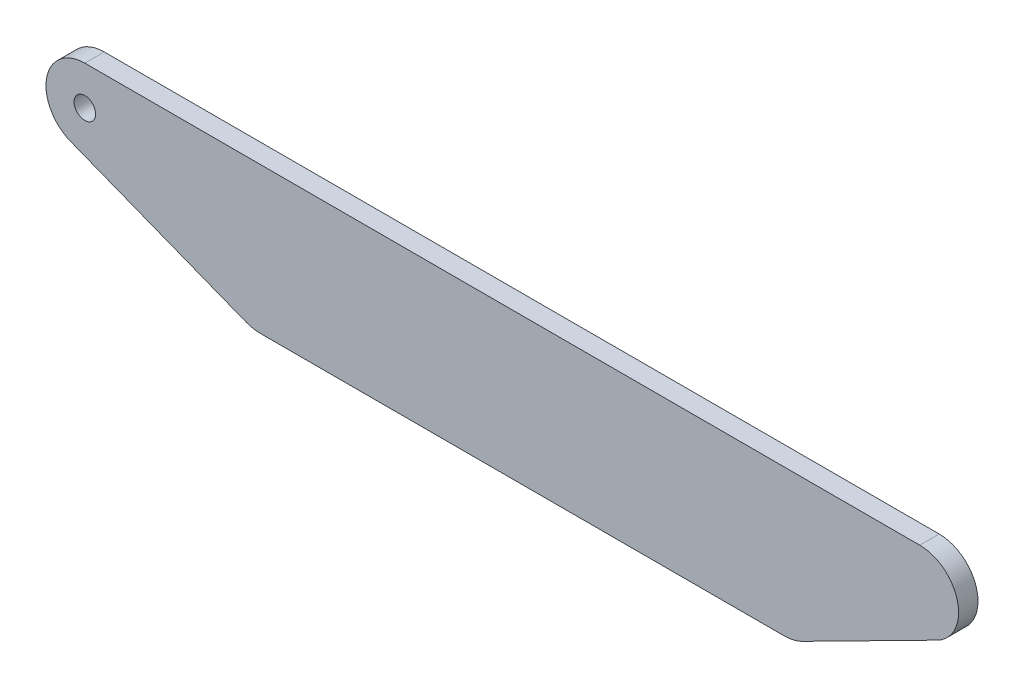
ISO-10303-21;
HEADER;
FILE_DESCRIPTION(('STEP AP214'),'2;1');
FILE_NAME('part.step','',(''),(''),'','','');
FILE_SCHEMA(('AUTOMOTIVE_DESIGN { 1 0 10303 214 1 1 1 1 }'));
ENDSEC;
DATA;
#1=APPLICATION_CONTEXT('core data for automotive mechanical design processes');
#2=APPLICATION_PROTOCOL_DEFINITION('international standard','automotive_design',2000,#1);
#3=PRODUCT_CONTEXT('',#1,'mechanical');
#4=PRODUCT('Part','Part','',(#3));
#5=PRODUCT_RELATED_PRODUCT_CATEGORY('part','',(#4));
#6=PRODUCT_DEFINITION_FORMATION('','',#4);
#7=PRODUCT_DEFINITION_CONTEXT('part definition',#1,'design');
#8=PRODUCT_DEFINITION('design','',#6,#7);
#9=PRODUCT_DEFINITION_SHAPE('','',#8);
#10=(LENGTH_UNIT() NAMED_UNIT(*) SI_UNIT(.MILLI.,.METRE.));
#11=(NAMED_UNIT(*) PLANE_ANGLE_UNIT() SI_UNIT($,.RADIAN.));
#12=(NAMED_UNIT(*) SI_UNIT($,.STERADIAN.) SOLID_ANGLE_UNIT());
#13=UNCERTAINTY_MEASURE_WITH_UNIT(LENGTH_MEASURE(1.E-05),#10,'distance_accuracy_value','');
#14=(GEOMETRIC_REPRESENTATION_CONTEXT(3) GLOBAL_UNCERTAINTY_ASSIGNED_CONTEXT((#13)) GLOBAL_UNIT_ASSIGNED_CONTEXT((#10,
#11,#12)) REPRESENTATION_CONTEXT('',''));
#15=CARTESIAN_POINT('',(0.,0.,0.));
#16=DIRECTION('',(0.,0.,1.));
#17=DIRECTION('',(1.,0.,0.));
#18=AXIS2_PLACEMENT_3D('',#15,#16,#17);
#19=CARTESIAN_POINT('',(-44.8305259232384,-388.04890917295,20.));
#20=DIRECTION('',(0.,0.,-1.));
#21=DIRECTION('',(-1.,0.,0.));
#22=AXIS2_PLACEMENT_3D('',#19,#20,#21);
#23=PLANE('',#22);
#24=CARTESIAN_POINT('',(-44.8305259232384,-388.04890917295,20.));
#25=DIRECTION('',(0.,0.,1.));
#26=DIRECTION('',(-1.,0.,0.));
#27=AXIS2_PLACEMENT_3D('',#24,#25,#26);
#28=CIRCLE('',#27,39.999999999999);
#29=CARTESIAN_POINT('',(-59.4061073248756,-425.298773962022,20.));
#30=VERTEX_POINT('',#29);
#31=CARTESIAN_POINT('',(-44.8305259232382,-428.048909172949,20.));
#32=VERTEX_POINT('',#31);
#33=EDGE_CURVE('E164',#30,#32,#28,.T.);
#34=ORIENTED_EDGE('',*,*,#33,.T.);
#35=DIRECTION('',(1.,0.,0.));
#36=VECTOR('',#35,1.);
#37=CARTESIAN_POINT('',(-44.8305259232382,-428.048909172949,20.));
#38=LINE('',#37,#36);
#39=CARTESIAN_POINT('',(495.169474076762,-428.048909172949,20.));
#40=VERTEX_POINT('',#39);
#41=EDGE_CURVE('E100',#32,#40,#38,.T.);
#42=ORIENTED_EDGE('',*,*,#41,.T.);
#43=CARTESIAN_POINT('',(495.169474076762,-388.048909172949,20.));
#44=DIRECTION('',(0.,0.,1.));
#45=DIRECTION('',(-1.,0.,0.));
#46=AXIS2_PLACEMENT_3D('',#43,#44,#45);
#47=CIRCLE('',#46,39.9999999999999);
#48=CARTESIAN_POINT('',(513.276061102956,-423.716142122294,20.));
#49=VERTEX_POINT('',#48);
#50=EDGE_CURVE('E185',#40,#49,#47,.T.);
#51=ORIENTED_EDGE('',*,*,#50,.T.);
#52=DIRECTION('',(0.891680823733626,0.452664675654863,0.));
#53=VECTOR('',#52,1.);
#54=CARTESIAN_POINT('',(513.276061102956,-423.716142122294,20.));
#55=LINE('',#54,#53);
#56=CARTESIAN_POINT('',(652.565382984301,-353.00546400364,20.));
#57=VERTEX_POINT('',#56);
#58=EDGE_CURVE('E199',#49,#57,#55,.T.);
#59=ORIENTED_EDGE('',*,*,#58,.T.);
#60=CARTESIAN_POINT('',(634.458795958107,-317.338231054295,20.));
#61=DIRECTION('',(0.,0.,1.));
#62=DIRECTION('',(-1.,0.,0.));
#63=AXIS2_PLACEMENT_3D('',#60,#61,#62);
#64=CIRCLE('',#63,40.0000000000001);
#65=CARTESIAN_POINT('',(634.458795958107,-277.338231054294,20.));
#66=VERTEX_POINT('',#65);
#67=EDGE_CURVE('E119',#57,#66,#64,.T.);
#68=ORIENTED_EDGE('',*,*,#67,.T.);
#69=DIRECTION('',(-1.,0.,0.));
#70=VECTOR('',#69,1.);
#71=CARTESIAN_POINT('',(-225.541204041893,-277.338231054295,20.));
#72=LINE('',#71,#70);
#73=CARTESIAN_POINT('',(-225.541204041893,-277.338231054295,20.));
#74=VERTEX_POINT('',#73);
#75=EDGE_CURVE('E113',#66,#74,#72,.T.);
#76=ORIENTED_EDGE('',*,*,#75,.T.);
#77=CARTESIAN_POINT('',(-225.541204041893,-317.338231054295,20.));
#78=DIRECTION('',(0.,0.,1.));
#79=DIRECTION('',(1.,0.,0.));
#80=AXIS2_PLACEMENT_3D('',#77,#78,#79);
#81=CIRCLE('',#80,40.);
#82=CARTESIAN_POINT('',(-240.116785443531,-354.588095843368,20.));
#83=VERTEX_POINT('',#82);
#84=EDGE_CURVE('E117',#74,#83,#81,.T.);
#85=ORIENTED_EDGE('',*,*,#84,.T.);
#86=DIRECTION('',(0.931246619726832,-0.364389535040935,0.));
#87=VECTOR('',#86,1.);
#88=CARTESIAN_POINT('',(-240.116785443531,-354.588095843368,20.));
#89=LINE('',#88,#87);
#90=EDGE_CURVE('E57',#83,#30,#89,.T.);
#91=ORIENTED_EDGE('',*,*,#90,.T.);
#92=EDGE_LOOP('',(#34,#42,#51,#59,#68,#76,#85,#91));
#93=FACE_BOUND('',#92,.T.);
#94=CARTESIAN_POINT('',(-225.541204041893,-317.338231054295,20.));
#95=DIRECTION('',(0.,0.,1.));
#96=DIRECTION('',(1.,0.,0.));
#97=AXIS2_PLACEMENT_3D('',#94,#95,#96);
#98=CIRCLE('',#97,11.1125);
#99=CARTESIAN_POINT('',(-214.428704041893,-317.338231054295,20.));
#100=VERTEX_POINT('',#99);
#101=EDGE_CURVE('E146',#100,#100,#98,.T.);
#102=ORIENTED_EDGE('',*,*,#101,.F.);
#103=EDGE_LOOP('',(#102));
#104=FACE_BOUND('',#103,.T.);
#105=ADVANCED_FACE('F39',(#93,#104),#23,.F.);
#106=CARTESIAN_POINT('',(-44.8305259232384,-388.04890917295,0.));
#107=DIRECTION('',(0.,0.,-1.));
#108=DIRECTION('',(-1.,0.,0.));
#109=AXIS2_PLACEMENT_3D('',#106,#107,#108);
#110=PLANE('',#109);
#111=CARTESIAN_POINT('',(-44.8305259232384,-388.04890917295,0.));
#112=DIRECTION('',(0.,0.,1.));
#113=DIRECTION('',(-1.,0.,0.));
#114=AXIS2_PLACEMENT_3D('',#111,#112,#113);
#115=CIRCLE('',#114,39.999999999999);
#116=CARTESIAN_POINT('',(-59.4061073248756,-425.298773962022,0.));
#117=VERTEX_POINT('',#116);
#118=CARTESIAN_POINT('',(-44.8305259232382,-428.048909172949,0.));
#119=VERTEX_POINT('',#118);
#120=EDGE_CURVE('E141',#117,#119,#115,.T.);
#121=ORIENTED_EDGE('',*,*,#120,.F.);
#122=DIRECTION('',(0.931246619726832,-0.364389535040935,0.));
#123=VECTOR('',#122,1.);
#124=CARTESIAN_POINT('',(-240.116785443531,-354.588095843368,0.));
#125=LINE('',#124,#123);
#126=CARTESIAN_POINT('',(-240.116785443531,-354.588095843368,0.));
#127=VERTEX_POINT('',#126);
#128=EDGE_CURVE('E92',#127,#117,#125,.T.);
#129=ORIENTED_EDGE('',*,*,#128,.F.);
#130=CARTESIAN_POINT('',(-225.541204041893,-317.338231054295,0.));
#131=DIRECTION('',(0.,0.,1.));
#132=DIRECTION('',(1.,0.,0.));
#133=AXIS2_PLACEMENT_3D('',#130,#131,#132);
#134=CIRCLE('',#133,40.);
#135=CARTESIAN_POINT('',(-225.541204041893,-277.338231054295,0.));
#136=VERTEX_POINT('',#135);
#137=EDGE_CURVE('E86',#136,#127,#134,.T.);
#138=ORIENTED_EDGE('',*,*,#137,.F.);
#139=DIRECTION('',(-1.,0.,0.));
#140=VECTOR('',#139,1.);
#141=CARTESIAN_POINT('',(-225.541204041893,-277.338231054295,0.));
#142=LINE('',#141,#140);
#143=CARTESIAN_POINT('',(634.458795958107,-277.338231054294,0.));
#144=VERTEX_POINT('',#143);
#145=EDGE_CURVE('E128',#144,#136,#142,.T.);
#146=ORIENTED_EDGE('',*,*,#145,.F.);
#147=CARTESIAN_POINT('',(634.458795958107,-317.338231054295,0.));
#148=DIRECTION('',(0.,0.,1.));
#149=DIRECTION('',(-1.,0.,0.));
#150=AXIS2_PLACEMENT_3D('',#147,#148,#149);
#151=CIRCLE('',#150,40.0000000000001);
#152=CARTESIAN_POINT('',(652.565382984301,-353.00546400364,0.));
#153=VERTEX_POINT('',#152);
#154=EDGE_CURVE('E155',#153,#144,#151,.T.);
#155=ORIENTED_EDGE('',*,*,#154,.F.);
#156=DIRECTION('',(0.891680823733626,0.452664675654863,0.));
#157=VECTOR('',#156,1.);
#158=CARTESIAN_POINT('',(513.276061102956,-423.716142122294,0.));
#159=LINE('',#158,#157);
#160=CARTESIAN_POINT('',(513.276061102956,-423.716142122294,0.));
#161=VERTEX_POINT('',#160);
#162=EDGE_CURVE('E152',#161,#153,#159,.T.);
#163=ORIENTED_EDGE('',*,*,#162,.F.);
#164=CARTESIAN_POINT('',(495.169474076762,-388.048909172949,0.));
#165=DIRECTION('',(0.,0.,1.));
#166=DIRECTION('',(-1.,0.,0.));
#167=AXIS2_PLACEMENT_3D('',#164,#165,#166);
#168=CIRCLE('',#167,39.9999999999999);
#169=CARTESIAN_POINT('',(495.169474076762,-428.048909172949,0.));
#170=VERTEX_POINT('',#169);
#171=EDGE_CURVE('E149',#170,#161,#168,.T.);
#172=ORIENTED_EDGE('',*,*,#171,.F.);
#173=DIRECTION('',(1.,0.,0.));
#174=VECTOR('',#173,1.);
#175=CARTESIAN_POINT('',(-44.8305259232382,-428.048909172949,0.));
#176=LINE('',#175,#174);
#177=EDGE_CURVE('E145',#119,#170,#176,.T.);
#178=ORIENTED_EDGE('',*,*,#177,.F.);
#179=EDGE_LOOP('',(#121,#129,#138,#146,#155,#163,#172,#178));
#180=FACE_BOUND('',#179,.T.);
#181=CARTESIAN_POINT('',(-225.541204041893,-317.338231054295,0.));
#182=DIRECTION('',(0.,0.,1.));
#183=DIRECTION('',(1.,0.,0.));
#184=AXIS2_PLACEMENT_3D('',#181,#182,#183);
#185=CIRCLE('',#184,11.1125);
#186=CARTESIAN_POINT('',(-214.428704041893,-317.338231054295,0.));
#187=VERTEX_POINT('',#186);
#188=EDGE_CURVE('E209',#187,#187,#185,.T.);
#189=ORIENTED_EDGE('',*,*,#188,.T.);
#190=EDGE_LOOP('',(#189));
#191=FACE_BOUND('',#190,.T.);
#192=ADVANCED_FACE('F189',(#180,#191),#110,.T.);
#193=CARTESIAN_POINT('',(-44.8305259232384,-388.04890917295,20.));
#194=DIRECTION('',(0.,0.,-1.));
#195=DIRECTION('',(-1.,0.,0.));
#196=AXIS2_PLACEMENT_3D('',#193,#194,#195);
#197=CYLINDRICAL_SURFACE('',#196,39.999999999999);
#198=ORIENTED_EDGE('',*,*,#120,.T.);
#199=DIRECTION('',(0.,0.,-1.));
#200=VECTOR('',#199,1.);
#201=CARTESIAN_POINT('',(-44.8305259232382,-428.048909172949,20.));
#202=LINE('',#201,#200);
#203=EDGE_CURVE('E11',#32,#119,#202,.T.);
#204=ORIENTED_EDGE('',*,*,#203,.F.);
#205=ORIENTED_EDGE('',*,*,#33,.F.);
#206=DIRECTION('',(0.,0.,-1.));
#207=VECTOR('',#206,1.);
#208=CARTESIAN_POINT('',(-59.4061073248756,-425.298773962022,20.));
#209=LINE('',#208,#207);
#210=EDGE_CURVE('E137',#30,#117,#209,.T.);
#211=ORIENTED_EDGE('',*,*,#210,.T.);
#212=EDGE_LOOP('',(#198,#204,#205,#211));
#213=FACE_BOUND('',#212,.T.);
#214=ADVANCED_FACE('F41',(#213),#197,.T.);
#215=CARTESIAN_POINT('',(-44.8305259232382,-428.048909172949,20.));
#216=DIRECTION('',(0.,1.,0.));
#217=DIRECTION('',(0.,0.,1.));
#218=AXIS2_PLACEMENT_3D('',#215,#216,#217);
#219=PLANE('',#218);
#220=ORIENTED_EDGE('',*,*,#177,.T.);
#221=DIRECTION('',(0.,0.,-1.));
#222=VECTOR('',#221,1.);
#223=CARTESIAN_POINT('',(495.169474076762,-428.048909172949,20.));
#224=LINE('',#223,#222);
#225=EDGE_CURVE('E49',#40,#170,#224,.T.);
#226=ORIENTED_EDGE('',*,*,#225,.F.);
#227=ORIENTED_EDGE('',*,*,#41,.F.);
#228=ORIENTED_EDGE('',*,*,#203,.T.);
#229=EDGE_LOOP('',(#220,#226,#227,#228));
#230=FACE_BOUND('',#229,.T.);
#231=ADVANCED_FACE('F239',(#230),#219,.F.);
#232=CARTESIAN_POINT('',(495.169474076762,-388.048909172949,20.));
#233=DIRECTION('',(0.,0.,-1.));
#234=DIRECTION('',(-1.,0.,0.));
#235=AXIS2_PLACEMENT_3D('',#232,#233,#234);
#236=CYLINDRICAL_SURFACE('',#235,39.9999999999999);
#237=ORIENTED_EDGE('',*,*,#171,.T.);
#238=DIRECTION('',(0.,0.,-1.));
#239=VECTOR('',#238,1.);
#240=CARTESIAN_POINT('',(513.276061102956,-423.716142122294,20.));
#241=LINE('',#240,#239);
#242=EDGE_CURVE('E175',#49,#161,#241,.T.);
#243=ORIENTED_EDGE('',*,*,#242,.F.);
#244=ORIENTED_EDGE('',*,*,#50,.F.);
#245=ORIENTED_EDGE('',*,*,#225,.T.);
#246=EDGE_LOOP('',(#237,#243,#244,#245));
#247=FACE_BOUND('',#246,.T.);
#248=ADVANCED_FACE('F183',(#247),#236,.T.);
#249=CARTESIAN_POINT('',(513.276061102956,-423.716142122294,20.));
#250=DIRECTION('',(-0.452664675654863,0.891680823733626,0.));
#251=DIRECTION('',(-0.891680823733626,-0.452664675654863,0.));
#252=AXIS2_PLACEMENT_3D('',#249,#250,#251);
#253=PLANE('',#252);
#254=ORIENTED_EDGE('',*,*,#162,.T.);
#255=DIRECTION('',(0.,0.,-1.));
#256=VECTOR('',#255,1.);
#257=CARTESIAN_POINT('',(652.565382984301,-353.00546400364,20.));
#258=LINE('',#257,#256);
#259=EDGE_CURVE('E171',#57,#153,#258,.T.);
#260=ORIENTED_EDGE('',*,*,#259,.F.);
#261=ORIENTED_EDGE('',*,*,#58,.F.);
#262=ORIENTED_EDGE('',*,*,#242,.T.);
#263=EDGE_LOOP('',(#254,#260,#261,#262));
#264=FACE_BOUND('',#263,.T.);
#265=ADVANCED_FACE('F194',(#264),#253,.F.);
#266=CARTESIAN_POINT('',(634.458795958107,-317.338231054295,20.));
#267=DIRECTION('',(0.,0.,-1.));
#268=DIRECTION('',(-1.,0.,0.));
#269=AXIS2_PLACEMENT_3D('',#266,#267,#268);
#270=CYLINDRICAL_SURFACE('',#269,40.0000000000001);
#271=ORIENTED_EDGE('',*,*,#154,.T.);
#272=DIRECTION('',(0.,0.,-1.));
#273=VECTOR('',#272,1.);
#274=CARTESIAN_POINT('',(634.458795958107,-277.338231054294,20.));
#275=LINE('',#274,#273);
#276=EDGE_CURVE('E130',#66,#144,#275,.T.);
#277=ORIENTED_EDGE('',*,*,#276,.F.);
#278=ORIENTED_EDGE('',*,*,#67,.F.);
#279=ORIENTED_EDGE('',*,*,#259,.T.);
#280=EDGE_LOOP('',(#271,#277,#278,#279));
#281=FACE_BOUND('',#280,.T.);
#282=ADVANCED_FACE('F197',(#281),#270,.T.);
#283=CARTESIAN_POINT('',(-225.541204041893,-277.338231054295,20.));
#284=DIRECTION('',(0.,-1.,0.));
#285=DIRECTION('',(1.,0.,0.));
#286=AXIS2_PLACEMENT_3D('',#283,#284,#285);
#287=PLANE('',#286);
#288=ORIENTED_EDGE('',*,*,#145,.T.);
#289=DIRECTION('',(0.,0.,-1.));
#290=VECTOR('',#289,1.);
#291=CARTESIAN_POINT('',(-225.541204041893,-277.338231054295,20.));
#292=LINE('',#291,#290);
#293=EDGE_CURVE('E125',#74,#136,#292,.T.);
#294=ORIENTED_EDGE('',*,*,#293,.F.);
#295=ORIENTED_EDGE('',*,*,#75,.F.);
#296=ORIENTED_EDGE('',*,*,#276,.T.);
#297=EDGE_LOOP('',(#288,#294,#295,#296));
#298=FACE_BOUND('',#297,.T.);
#299=ADVANCED_FACE('F126',(#298),#287,.F.);
#300=CARTESIAN_POINT('',(-225.541204041893,-317.338231054295,20.));
#301=DIRECTION('',(0.,0.,-1.));
#302=DIRECTION('',(-1.,0.,0.));
#303=AXIS2_PLACEMENT_3D('',#300,#301,#302);
#304=CYLINDRICAL_SURFACE('',#303,40.);
#305=ORIENTED_EDGE('',*,*,#137,.T.);
#306=DIRECTION('',(0.,0.,-1.));
#307=VECTOR('',#306,1.);
#308=CARTESIAN_POINT('',(-240.116785443531,-354.588095843368,20.));
#309=LINE('',#308,#307);
#310=EDGE_CURVE('E131',#83,#127,#309,.T.);
#311=ORIENTED_EDGE('',*,*,#310,.F.);
#312=ORIENTED_EDGE('',*,*,#84,.F.);
#313=ORIENTED_EDGE('',*,*,#293,.T.);
#314=EDGE_LOOP('',(#305,#311,#312,#313));
#315=FACE_BOUND('',#314,.T.);
#316=ADVANCED_FACE('F133',(#315),#304,.T.);
#317=CARTESIAN_POINT('',(-240.116785443531,-354.588095843368,20.));
#318=DIRECTION('',(0.364389535040935,0.931246619726832,0.));
#319=DIRECTION('',(-0.931246619726832,0.364389535040935,0.));
#320=AXIS2_PLACEMENT_3D('',#317,#318,#319);
#321=PLANE('',#320);
#322=ORIENTED_EDGE('',*,*,#128,.T.);
#323=ORIENTED_EDGE('',*,*,#210,.F.);
#324=ORIENTED_EDGE('',*,*,#90,.F.);
#325=ORIENTED_EDGE('',*,*,#310,.T.);
#326=EDGE_LOOP('',(#322,#323,#324,#325));
#327=FACE_BOUND('',#326,.T.);
#328=ADVANCED_FACE('F227',(#327),#321,.F.);
#329=CARTESIAN_POINT('',(-225.541204041893,-317.338231054295,20.));
#330=DIRECTION('',(0.,0.,-1.));
#331=DIRECTION('',(-1.,0.,0.));
#332=AXIS2_PLACEMENT_3D('',#329,#330,#331);
#333=CYLINDRICAL_SURFACE('',#332,11.1125);
#334=ORIENTED_EDGE('',*,*,#101,.T.);
#335=EDGE_LOOP('',(#334));
#336=FACE_BOUND('',#335,.T.);
#337=ORIENTED_EDGE('',*,*,#188,.F.);
#338=EDGE_LOOP('',(#337));
#339=FACE_BOUND('',#338,.T.);
#340=ADVANCED_FACE('F217',(#336,#339),#333,.F.);
#341=CLOSED_SHELL('',(#105,#192,#214,#231,#248,#265,#282,#299,#316,#328,#340));
#342=MANIFOLD_SOLID_BREP('B2',#341);
#343=ADVANCED_BREP_SHAPE_REPRESENTATION('',(#18,#342),#14);
#344=SHAPE_DEFINITION_REPRESENTATION(#9,#343);
ENDSEC;
END-ISO-10303-21;
